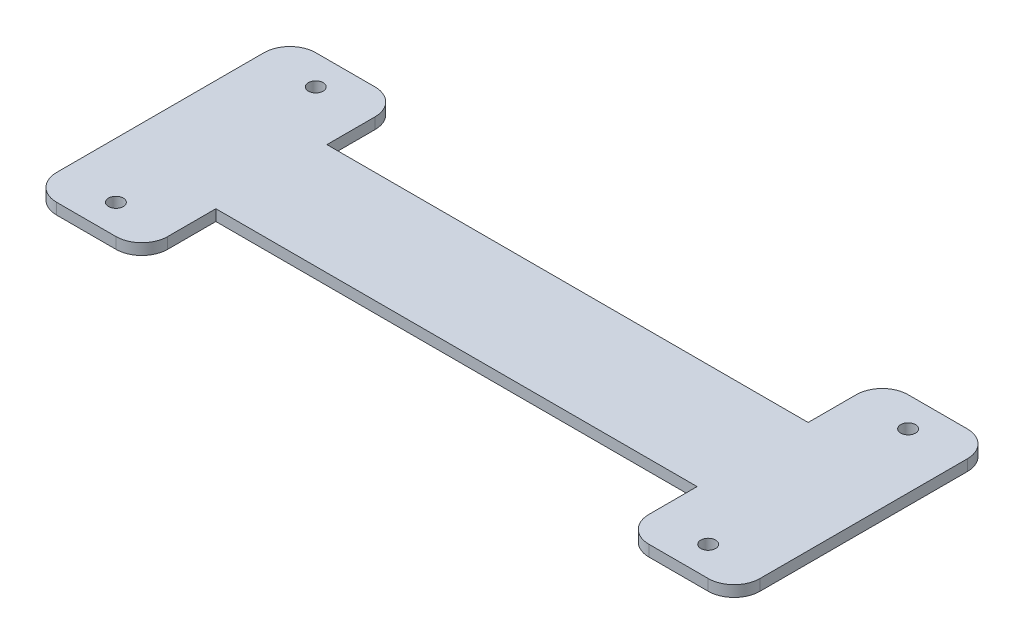
ISO-10303-21;
HEADER;
FILE_DESCRIPTION(('STEP AP214'),'2;1');
FILE_NAME('part.step','',(''),(''),'','','');
FILE_SCHEMA(('AUTOMOTIVE_DESIGN { 1 0 10303 214 1 1 1 1 }'));
ENDSEC;
DATA;
#1=APPLICATION_CONTEXT('core data for automotive mechanical design processes');
#2=APPLICATION_PROTOCOL_DEFINITION('international standard','automotive_design',2000,#1);
#3=PRODUCT_CONTEXT('',#1,'mechanical');
#4=PRODUCT('Part','Part','',(#3));
#5=PRODUCT_RELATED_PRODUCT_CATEGORY('part','',(#4));
#6=PRODUCT_DEFINITION_FORMATION('','',#4);
#7=PRODUCT_DEFINITION_CONTEXT('part definition',#1,'design');
#8=PRODUCT_DEFINITION('design','',#6,#7);
#9=PRODUCT_DEFINITION_SHAPE('','',#8);
#10=(LENGTH_UNIT() NAMED_UNIT(*) SI_UNIT(.MILLI.,.METRE.));
#11=(NAMED_UNIT(*) PLANE_ANGLE_UNIT() SI_UNIT($,.RADIAN.));
#12=(NAMED_UNIT(*) SI_UNIT($,.STERADIAN.) SOLID_ANGLE_UNIT());
#13=UNCERTAINTY_MEASURE_WITH_UNIT(LENGTH_MEASURE(1.E-05),#10,'distance_accuracy_value','');
#14=(GEOMETRIC_REPRESENTATION_CONTEXT(3) GLOBAL_UNCERTAINTY_ASSIGNED_CONTEXT((#13)) GLOBAL_UNIT_ASSIGNED_CONTEXT((#10,
#11,#12)) REPRESENTATION_CONTEXT('',''));
#15=CARTESIAN_POINT('',(0.,0.,0.));
#16=DIRECTION('',(0.,0.,1.));
#17=DIRECTION('',(1.,0.,0.));
#18=AXIS2_PLACEMENT_3D('',#15,#16,#17);
#19=CARTESIAN_POINT('',(0.,3.,70.));
#20=DIRECTION('',(0.,0.,-1.));
#21=DIRECTION('',(-1.,0.,0.));
#22=AXIS2_PLACEMENT_3D('',#19,#20,#21);
#23=PLANE('',#22);
#24=DIRECTION('',(1.,0.,0.));
#25=VECTOR('',#24,1.);
#26=CARTESIAN_POINT('',(0.,0.,70.));
#27=LINE('',#26,#25);
#28=CARTESIAN_POINT('',(7.00000000000001,0.,70.));
#29=VERTEX_POINT('',#28);
#30=CARTESIAN_POINT('',(23.,0.,70.));
#31=VERTEX_POINT('',#30);
#32=EDGE_CURVE('E274',#29,#31,#27,.T.);
#33=ORIENTED_EDGE('',*,*,#32,.T.);
#34=DIRECTION('',(0.,1.,0.));
#35=VECTOR('',#34,1.);
#36=CARTESIAN_POINT('',(23.,3.,70.));
#37=LINE('',#36,#35);
#38=CARTESIAN_POINT('',(23.,3.,70.));
#39=VERTEX_POINT('',#38);
#40=EDGE_CURVE('E333',#31,#39,#37,.T.);
#41=ORIENTED_EDGE('',*,*,#40,.T.);
#42=DIRECTION('',(1.,0.,0.));
#43=VECTOR('',#42,1.);
#44=CARTESIAN_POINT('',(0.,3.,70.));
#45=LINE('',#44,#43);
#46=CARTESIAN_POINT('',(7.00000000000001,3.,70.));
#47=VERTEX_POINT('',#46);
#48=EDGE_CURVE('E260',#47,#39,#45,.T.);
#49=ORIENTED_EDGE('',*,*,#48,.F.);
#50=DIRECTION('',(0.,-1.,0.));
#51=VECTOR('',#50,1.);
#52=CARTESIAN_POINT('',(7.00000000000001,3.,70.));
#53=LINE('',#52,#51);
#54=EDGE_CURVE('E330',#47,#29,#53,.T.);
#55=ORIENTED_EDGE('',*,*,#54,.T.);
#56=EDGE_LOOP('',(#33,#41,#49,#55));
#57=FACE_BOUND('',#56,.T.);
#58=ADVANCED_FACE('F33',(#57),#23,.F.);
#59=CARTESIAN_POINT('',(0.,3.,0.));
#60=DIRECTION('',(0.,0.,1.));
#61=DIRECTION('',(1.,0.,0.));
#62=AXIS2_PLACEMENT_3D('',#59,#60,#61);
#63=PLANE('',#62);
#64=DIRECTION('',(-1.,0.,0.));
#65=VECTOR('',#64,1.);
#66=CARTESIAN_POINT('',(0.,0.,0.));
#67=LINE('',#66,#65);
#68=CARTESIAN_POINT('',(23.,0.,0.));
#69=VERTEX_POINT('',#68);
#70=CARTESIAN_POINT('',(7.,0.,0.));
#71=VERTEX_POINT('',#70);
#72=EDGE_CURVE('E278',#69,#71,#67,.T.);
#73=ORIENTED_EDGE('',*,*,#72,.T.);
#74=DIRECTION('',(0.,-1.,0.));
#75=VECTOR('',#74,1.);
#76=CARTESIAN_POINT('',(7.,3.,0.));
#77=LINE('',#76,#75);
#78=CARTESIAN_POINT('',(7.,3.,0.));
#79=VERTEX_POINT('',#78);
#80=EDGE_CURVE('E41',#71,#79,#77,.F.);
#81=ORIENTED_EDGE('',*,*,#80,.T.);
#82=DIRECTION('',(-1.,0.,0.));
#83=VECTOR('',#82,1.);
#84=CARTESIAN_POINT('',(0.,3.,0.));
#85=LINE('',#84,#83);
#86=CARTESIAN_POINT('',(23.,3.,0.));
#87=VERTEX_POINT('',#86);
#88=EDGE_CURVE('E265',#87,#79,#85,.T.);
#89=ORIENTED_EDGE('',*,*,#88,.F.);
#90=DIRECTION('',(0.,1.,0.));
#91=VECTOR('',#90,1.);
#92=CARTESIAN_POINT('',(23.,3.,0.));
#93=LINE('',#92,#91);
#94=EDGE_CURVE('E342',#87,#69,#93,.F.);
#95=ORIENTED_EDGE('',*,*,#94,.T.);
#96=EDGE_LOOP('',(#73,#81,#89,#95));
#97=FACE_BOUND('',#96,.T.);
#98=ADVANCED_FACE('F346',(#97),#63,.F.);
#99=CARTESIAN_POINT('',(0.,3.,0.));
#100=DIRECTION('',(1.,0.,0.));
#101=DIRECTION('',(0.,0.,-1.));
#102=AXIS2_PLACEMENT_3D('',#99,#100,#101);
#103=PLANE('',#102);
#104=DIRECTION('',(0.,0.,1.));
#105=VECTOR('',#104,1.);
#106=CARTESIAN_POINT('',(0.,0.,0.));
#107=LINE('',#106,#105);
#108=CARTESIAN_POINT('',(0.,0.,7.));
#109=VERTEX_POINT('',#108);
#110=CARTESIAN_POINT('',(0.,0.,63.));
#111=VERTEX_POINT('',#110);
#112=EDGE_CURVE('E253',#109,#111,#107,.T.);
#113=ORIENTED_EDGE('',*,*,#112,.T.);
#114=DIRECTION('',(0.,-1.,0.));
#115=VECTOR('',#114,1.);
#116=CARTESIAN_POINT('',(0.,3.,63.));
#117=LINE('',#116,#115);
#118=CARTESIAN_POINT('',(0.,3.,63.));
#119=VERTEX_POINT('',#118);
#120=EDGE_CURVE('E340',#111,#119,#117,.F.);
#121=ORIENTED_EDGE('',*,*,#120,.T.);
#122=DIRECTION('',(0.,0.,1.));
#123=VECTOR('',#122,1.);
#124=CARTESIAN_POINT('',(0.,3.,0.));
#125=LINE('',#124,#123);
#126=CARTESIAN_POINT('',(0.,3.,7.));
#127=VERTEX_POINT('',#126);
#128=EDGE_CURVE('E256',#127,#119,#125,.T.);
#129=ORIENTED_EDGE('',*,*,#128,.F.);
#130=DIRECTION('',(0.,-1.,0.));
#131=VECTOR('',#130,1.);
#132=CARTESIAN_POINT('',(0.,3.,7.));
#133=LINE('',#132,#131);
#134=EDGE_CURVE('E337',#127,#109,#133,.T.);
#135=ORIENTED_EDGE('',*,*,#134,.T.);
#136=EDGE_LOOP('',(#113,#121,#129,#135));
#137=FACE_BOUND('',#136,.T.);
#138=ADVANCED_FACE('F357',(#137),#103,.F.);
#139=CARTESIAN_POINT('',(167.,3.,70.));
#140=VERTEX_POINT('',#139);
#141=CARTESIAN_POINT('',(183.,3.,70.));
#142=VERTEX_POINT('',#141);
#143=EDGE_CURVE('E258',#140,#142,#45,.T.);
#144=ORIENTED_EDGE('',*,*,#143,.F.);
#145=DIRECTION('',(0.,1.,0.));
#146=VECTOR('',#145,1.);
#147=CARTESIAN_POINT('',(167.,3.,70.));
#148=LINE('',#147,#146);
#149=CARTESIAN_POINT('',(167.,0.,70.));
#150=VERTEX_POINT('',#149);
#151=EDGE_CURVE('E328',#140,#150,#148,.F.);
#152=ORIENTED_EDGE('',*,*,#151,.T.);
#153=CARTESIAN_POINT('',(183.,0.,70.));
#154=VERTEX_POINT('',#153);
#155=EDGE_CURVE('E271',#150,#154,#27,.T.);
#156=ORIENTED_EDGE('',*,*,#155,.T.);
#157=DIRECTION('',(0.,-1.,0.));
#158=VECTOR('',#157,1.);
#159=CARTESIAN_POINT('',(183.,3.,70.));
#160=LINE('',#159,#158);
#161=EDGE_CURVE('E326',#154,#142,#160,.F.);
#162=ORIENTED_EDGE('',*,*,#161,.T.);
#163=EDGE_LOOP('',(#144,#152,#156,#162));
#164=FACE_BOUND('',#163,.T.);
#165=ADVANCED_FACE('F387',(#164),#23,.F.);
#166=CARTESIAN_POINT('',(190.,3.,0.));
#167=DIRECTION('',(-1.,0.,0.));
#168=DIRECTION('',(0.,0.,1.));
#169=AXIS2_PLACEMENT_3D('',#166,#167,#168);
#170=PLANE('',#169);
#171=DIRECTION('',(0.,0.,-1.));
#172=VECTOR('',#171,1.);
#173=CARTESIAN_POINT('',(190.,0.,0.));
#174=LINE('',#173,#172);
#175=CARTESIAN_POINT('',(190.,0.,63.));
#176=VERTEX_POINT('',#175);
#177=CARTESIAN_POINT('',(190.,0.,7.));
#178=VERTEX_POINT('',#177);
#179=EDGE_CURVE('E275',#176,#178,#174,.T.);
#180=ORIENTED_EDGE('',*,*,#179,.T.);
#181=DIRECTION('',(0.,-1.,0.));
#182=VECTOR('',#181,1.);
#183=CARTESIAN_POINT('',(190.,3.,7.));
#184=LINE('',#183,#182);
#185=CARTESIAN_POINT('',(190.,3.,7.));
#186=VERTEX_POINT('',#185);
#187=EDGE_CURVE('E305',#178,#186,#184,.F.);
#188=ORIENTED_EDGE('',*,*,#187,.T.);
#189=DIRECTION('',(0.,0.,-1.));
#190=VECTOR('',#189,1.);
#191=CARTESIAN_POINT('',(190.,3.,0.));
#192=LINE('',#191,#190);
#193=CARTESIAN_POINT('',(190.,3.,63.));
#194=VERTEX_POINT('',#193);
#195=EDGE_CURVE('E262',#194,#186,#192,.T.);
#196=ORIENTED_EDGE('',*,*,#195,.F.);
#197=DIRECTION('',(0.,-1.,0.));
#198=VECTOR('',#197,1.);
#199=CARTESIAN_POINT('',(190.,3.,63.));
#200=LINE('',#199,#198);
#201=EDGE_CURVE('E302',#194,#176,#200,.T.);
#202=ORIENTED_EDGE('',*,*,#201,.T.);
#203=EDGE_LOOP('',(#180,#188,#196,#202));
#204=FACE_BOUND('',#203,.T.);
#205=ADVANCED_FACE('F399',(#204),#170,.F.);
#206=CARTESIAN_POINT('',(183.,3.,0.));
#207=VERTEX_POINT('',#206);
#208=CARTESIAN_POINT('',(167.,3.,0.));
#209=VERTEX_POINT('',#208);
#210=EDGE_CURVE('E268',#207,#209,#85,.T.);
#211=ORIENTED_EDGE('',*,*,#210,.F.);
#212=DIRECTION('',(0.,-1.,0.));
#213=VECTOR('',#212,1.);
#214=CARTESIAN_POINT('',(183.,3.,0.));
#215=LINE('',#214,#213);
#216=CARTESIAN_POINT('',(183.,0.,0.));
#217=VERTEX_POINT('',#216);
#218=EDGE_CURVE('E284',#207,#217,#215,.T.);
#219=ORIENTED_EDGE('',*,*,#218,.T.);
#220=CARTESIAN_POINT('',(167.,0.,0.));
#221=VERTEX_POINT('',#220);
#222=EDGE_CURVE('E259',#217,#221,#67,.T.);
#223=ORIENTED_EDGE('',*,*,#222,.T.);
#224=DIRECTION('',(0.,1.,0.));
#225=VECTOR('',#224,1.);
#226=CARTESIAN_POINT('',(167.,3.,0.));
#227=LINE('',#226,#225);
#228=EDGE_CURVE('E281',#221,#209,#227,.T.);
#229=ORIENTED_EDGE('',*,*,#228,.T.);
#230=EDGE_LOOP('',(#211,#219,#223,#229));
#231=FACE_BOUND('',#230,.T.);
#232=ADVANCED_FACE('F407',(#231),#63,.F.);
#233=CARTESIAN_POINT('',(0.,3.,0.));
#234=DIRECTION('',(0.,1.,0.));
#235=DIRECTION('',(0.,0.,1.));
#236=AXIS2_PLACEMENT_3D('',#233,#234,#235);
#237=PLANE('',#236);
#238=CARTESIAN_POINT('',(175.,3.,8.00000000000001));
#239=DIRECTION('',(0.,1.,0.));
#240=DIRECTION('',(0.,0.,1.));
#241=AXIS2_PLACEMENT_3D('',#238,#239,#240);
#242=CIRCLE('',#241,2.);
#243=CARTESIAN_POINT('',(175.,3.,10.));
#244=VERTEX_POINT('',#243);
#245=EDGE_CURVE('E215',#244,#244,#242,.T.);
#246=ORIENTED_EDGE('',*,*,#245,.F.);
#247=EDGE_LOOP('',(#246));
#248=FACE_BOUND('',#247,.T.);
#249=CARTESIAN_POINT('',(175.,3.,62.));
#250=DIRECTION('',(0.,1.,0.));
#251=DIRECTION('',(0.,0.,1.));
#252=AXIS2_PLACEMENT_3D('',#249,#250,#251);
#253=CIRCLE('',#252,2.);
#254=CARTESIAN_POINT('',(175.,3.,64.));
#255=VERTEX_POINT('',#254);
#256=EDGE_CURVE('E221',#255,#255,#253,.T.);
#257=ORIENTED_EDGE('',*,*,#256,.F.);
#258=EDGE_LOOP('',(#257));
#259=FACE_BOUND('',#258,.T.);
#260=CARTESIAN_POINT('',(15.,3.,62.));
#261=DIRECTION('',(0.,1.,0.));
#262=DIRECTION('',(0.,0.,1.));
#263=AXIS2_PLACEMENT_3D('',#260,#261,#262);
#264=CIRCLE('',#263,2.00000000000001);
#265=CARTESIAN_POINT('',(15.,3.,64.));
#266=VERTEX_POINT('',#265);
#267=EDGE_CURVE('E227',#266,#266,#264,.T.);
#268=ORIENTED_EDGE('',*,*,#267,.F.);
#269=EDGE_LOOP('',(#268));
#270=FACE_BOUND('',#269,.T.);
#271=ORIENTED_EDGE('',*,*,#195,.T.);
#272=CARTESIAN_POINT('',(183.,3.,7.));
#273=DIRECTION('',(0.,1.,0.));
#274=DIRECTION('',(0.,0.,1.));
#275=AXIS2_PLACEMENT_3D('',#272,#273,#274);
#276=CIRCLE('',#275,7.);
#277=EDGE_CURVE('E319',#186,#207,#276,.T.);
#278=ORIENTED_EDGE('',*,*,#277,.T.);
#279=ORIENTED_EDGE('',*,*,#210,.T.);
#280=CARTESIAN_POINT('',(167.,3.,7.));
#281=DIRECTION('',(0.,1.,0.));
#282=DIRECTION('',(0.,0.,1.));
#283=AXIS2_PLACEMENT_3D('',#280,#281,#282);
#284=CIRCLE('',#283,7.);
#285=CARTESIAN_POINT('',(160.,3.,7.));
#286=VERTEX_POINT('',#285);
#287=EDGE_CURVE('E317',#209,#286,#284,.T.);
#288=ORIENTED_EDGE('',*,*,#287,.T.);
#289=DIRECTION('',(0.,0.,-1.));
#290=VECTOR('',#289,1.);
#291=CARTESIAN_POINT('',(160.,3.,20.));
#292=LINE('',#291,#290);
#293=CARTESIAN_POINT('',(160.,3.,20.));
#294=VERTEX_POINT('',#293);
#295=EDGE_CURVE('E186',#294,#286,#292,.T.);
#296=ORIENTED_EDGE('',*,*,#295,.F.);
#297=DIRECTION('',(1.,0.,0.));
#298=VECTOR('',#297,1.);
#299=CARTESIAN_POINT('',(30.,3.,20.));
#300=LINE('',#299,#298);
#301=CARTESIAN_POINT('',(30.,3.,20.));
#302=VERTEX_POINT('',#301);
#303=EDGE_CURVE('E205',#302,#294,#300,.T.);
#304=ORIENTED_EDGE('',*,*,#303,.F.);
#305=DIRECTION('',(0.,0.,1.));
#306=VECTOR('',#305,1.);
#307=CARTESIAN_POINT('',(30.,3.,20.));
#308=LINE('',#307,#306);
#309=CARTESIAN_POINT('',(30.,3.,7.));
#310=VERTEX_POINT('',#309);
#311=EDGE_CURVE('E192',#310,#302,#308,.T.);
#312=ORIENTED_EDGE('',*,*,#311,.F.);
#313=CARTESIAN_POINT('',(23.,3.,7.));
#314=DIRECTION('',(0.,1.,0.));
#315=DIRECTION('',(0.,0.,1.));
#316=AXIS2_PLACEMENT_3D('',#313,#314,#315);
#317=CIRCLE('',#316,7.);
#318=EDGE_CURVE('E307',#310,#87,#317,.T.);
#319=ORIENTED_EDGE('',*,*,#318,.T.);
#320=ORIENTED_EDGE('',*,*,#88,.T.);
#321=CARTESIAN_POINT('',(7.,3.,7.));
#322=DIRECTION('',(0.,1.,0.));
#323=DIRECTION('',(0.,0.,1.));
#324=AXIS2_PLACEMENT_3D('',#321,#322,#323);
#325=CIRCLE('',#324,7.);
#326=EDGE_CURVE('E309',#79,#127,#325,.T.);
#327=ORIENTED_EDGE('',*,*,#326,.T.);
#328=ORIENTED_EDGE('',*,*,#128,.T.);
#329=CARTESIAN_POINT('',(7.00000000000001,3.,63.));
#330=DIRECTION('',(0.,1.,0.));
#331=DIRECTION('',(0.,0.,1.));
#332=AXIS2_PLACEMENT_3D('',#329,#330,#331);
#333=CIRCLE('',#332,7.);
#334=EDGE_CURVE('E56',#119,#47,#333,.T.);
#335=ORIENTED_EDGE('',*,*,#334,.T.);
#336=ORIENTED_EDGE('',*,*,#48,.T.);
#337=CARTESIAN_POINT('',(23.,3.,63.));
#338=DIRECTION('',(0.,1.,0.));
#339=DIRECTION('',(0.,0.,1.));
#340=AXIS2_PLACEMENT_3D('',#337,#338,#339);
#341=CIRCLE('',#340,7.);
#342=CARTESIAN_POINT('',(30.,3.,63.));
#343=VERTEX_POINT('',#342);
#344=EDGE_CURVE('E48',#39,#343,#341,.T.);
#345=ORIENTED_EDGE('',*,*,#344,.T.);
#346=DIRECTION('',(0.,0.,1.));
#347=VECTOR('',#346,1.);
#348=CARTESIAN_POINT('',(30.,3.,50.));
#349=LINE('',#348,#347);
#350=CARTESIAN_POINT('',(30.,3.,50.));
#351=VERTEX_POINT('',#350);
#352=EDGE_CURVE('E209',#351,#343,#349,.T.);
#353=ORIENTED_EDGE('',*,*,#352,.F.);
#354=DIRECTION('',(-1.,0.,0.));
#355=VECTOR('',#354,1.);
#356=CARTESIAN_POINT('',(30.,3.,50.));
#357=LINE('',#356,#355);
#358=CARTESIAN_POINT('',(160.,3.,50.));
#359=VERTEX_POINT('',#358);
#360=EDGE_CURVE('E235',#359,#351,#357,.T.);
#361=ORIENTED_EDGE('',*,*,#360,.F.);
#362=DIRECTION('',(0.,0.,-1.));
#363=VECTOR('',#362,1.);
#364=CARTESIAN_POINT('',(160.,3.,50.));
#365=LINE('',#364,#363);
#366=CARTESIAN_POINT('',(160.,3.,63.));
#367=VERTEX_POINT('',#366);
#368=EDGE_CURVE('E243',#367,#359,#365,.T.);
#369=ORIENTED_EDGE('',*,*,#368,.F.);
#370=CARTESIAN_POINT('',(167.,3.,63.));
#371=DIRECTION('',(0.,1.,0.));
#372=DIRECTION('',(0.,0.,1.));
#373=AXIS2_PLACEMENT_3D('',#370,#371,#372);
#374=CIRCLE('',#373,7.);
#375=EDGE_CURVE('E315',#367,#140,#374,.T.);
#376=ORIENTED_EDGE('',*,*,#375,.T.);
#377=ORIENTED_EDGE('',*,*,#143,.T.);
#378=CARTESIAN_POINT('',(183.,3.,63.));
#379=DIRECTION('',(0.,1.,0.));
#380=DIRECTION('',(0.,0.,1.));
#381=AXIS2_PLACEMENT_3D('',#378,#379,#380);
#382=CIRCLE('',#381,7.);
#383=EDGE_CURVE('E313',#142,#194,#382,.T.);
#384=ORIENTED_EDGE('',*,*,#383,.T.);
#385=EDGE_LOOP('',(#271,#278,#279,#288,#296,#304,#312,#319,#320,#327,#328,#335,#336,#345,#353,
#361,#369,#376,#377,#384));
#386=FACE_BOUND('',#385,.T.);
#387=CARTESIAN_POINT('',(15.,3.,8.));
#388=DIRECTION('',(0.,1.,0.));
#389=DIRECTION('',(0.,0.,1.));
#390=AXIS2_PLACEMENT_3D('',#387,#388,#389);
#391=CIRCLE('',#390,2.);
#392=CARTESIAN_POINT('',(15.,3.,10.));
#393=VERTEX_POINT('',#392);
#394=EDGE_CURVE('E214',#393,#393,#391,.T.);
#395=ORIENTED_EDGE('',*,*,#394,.F.);
#396=EDGE_LOOP('',(#395));
#397=FACE_BOUND('',#396,.T.);
#398=ADVANCED_FACE('F350',(#248,#259,#270,#386,#397),#237,.T.);
#399=CARTESIAN_POINT('',(0.,0.,0.));
#400=DIRECTION('',(0.,1.,0.));
#401=DIRECTION('',(0.,0.,1.));
#402=AXIS2_PLACEMENT_3D('',#399,#400,#401);
#403=PLANE('',#402);
#404=CARTESIAN_POINT('',(175.,0.,8.00000000000001));
#405=DIRECTION('',(0.,1.,0.));
#406=DIRECTION('',(0.,0.,1.));
#407=AXIS2_PLACEMENT_3D('',#404,#405,#406);
#408=CIRCLE('',#407,2.);
#409=CARTESIAN_POINT('',(175.,0.,10.));
#410=VERTEX_POINT('',#409);
#411=EDGE_CURVE('E211',#410,#410,#408,.T.);
#412=ORIENTED_EDGE('',*,*,#411,.T.);
#413=EDGE_LOOP('',(#412));
#414=FACE_BOUND('',#413,.T.);
#415=CARTESIAN_POINT('',(175.,0.,62.));
#416=DIRECTION('',(0.,1.,0.));
#417=DIRECTION('',(0.,0.,1.));
#418=AXIS2_PLACEMENT_3D('',#415,#416,#417);
#419=CIRCLE('',#418,2.);
#420=CARTESIAN_POINT('',(175.,0.,64.));
#421=VERTEX_POINT('',#420);
#422=EDGE_CURVE('E218',#421,#421,#419,.T.);
#423=ORIENTED_EDGE('',*,*,#422,.T.);
#424=EDGE_LOOP('',(#423));
#425=FACE_BOUND('',#424,.T.);
#426=CARTESIAN_POINT('',(15.,0.,62.));
#427=DIRECTION('',(0.,1.,0.));
#428=DIRECTION('',(0.,0.,1.));
#429=AXIS2_PLACEMENT_3D('',#426,#427,#428);
#430=CIRCLE('',#429,2.00000000000001);
#431=CARTESIAN_POINT('',(15.,0.,64.));
#432=VERTEX_POINT('',#431);
#433=EDGE_CURVE('E224',#432,#432,#430,.T.);
#434=ORIENTED_EDGE('',*,*,#433,.T.);
#435=EDGE_LOOP('',(#434));
#436=FACE_BOUND('',#435,.T.);
#437=ORIENTED_EDGE('',*,*,#222,.F.);
#438=CARTESIAN_POINT('',(183.,0.,7.));
#439=DIRECTION('',(0.,1.,0.));
#440=DIRECTION('',(0.,0.,1.));
#441=AXIS2_PLACEMENT_3D('',#438,#439,#440);
#442=CIRCLE('',#441,7.);
#443=EDGE_CURVE('E300',#217,#178,#442,.F.);
#444=ORIENTED_EDGE('',*,*,#443,.T.);
#445=ORIENTED_EDGE('',*,*,#179,.F.);
#446=CARTESIAN_POINT('',(183.,0.,63.));
#447=DIRECTION('',(0.,1.,0.));
#448=DIRECTION('',(0.,0.,1.));
#449=AXIS2_PLACEMENT_3D('',#446,#447,#448);
#450=CIRCLE('',#449,7.);
#451=EDGE_CURVE('E294',#176,#154,#450,.F.);
#452=ORIENTED_EDGE('',*,*,#451,.T.);
#453=ORIENTED_EDGE('',*,*,#155,.F.);
#454=CARTESIAN_POINT('',(167.,0.,63.));
#455=DIRECTION('',(0.,1.,0.));
#456=DIRECTION('',(0.,0.,1.));
#457=AXIS2_PLACEMENT_3D('',#454,#455,#456);
#458=CIRCLE('',#457,7.);
#459=CARTESIAN_POINT('',(160.,0.,63.));
#460=VERTEX_POINT('',#459);
#461=EDGE_CURVE('E296',#150,#460,#458,.F.);
#462=ORIENTED_EDGE('',*,*,#461,.T.);
#463=DIRECTION('',(0.,0.,-1.));
#464=VECTOR('',#463,1.);
#465=CARTESIAN_POINT('',(160.,0.,50.));
#466=LINE('',#465,#464);
#467=CARTESIAN_POINT('',(160.,0.,50.));
#468=VERTEX_POINT('',#467);
#469=EDGE_CURVE('E234',#460,#468,#466,.T.);
#470=ORIENTED_EDGE('',*,*,#469,.T.);
#471=DIRECTION('',(-1.,0.,0.));
#472=VECTOR('',#471,1.);
#473=CARTESIAN_POINT('',(30.,0.,50.));
#474=LINE('',#473,#472);
#475=CARTESIAN_POINT('',(30.,0.,50.));
#476=VERTEX_POINT('',#475);
#477=EDGE_CURVE('E237',#468,#476,#474,.T.);
#478=ORIENTED_EDGE('',*,*,#477,.T.);
#479=DIRECTION('',(0.,0.,1.));
#480=VECTOR('',#479,1.);
#481=CARTESIAN_POINT('',(30.,0.,50.));
#482=LINE('',#481,#480);
#483=CARTESIAN_POINT('',(30.,0.,63.));
#484=VERTEX_POINT('',#483);
#485=EDGE_CURVE('E231',#476,#484,#482,.T.);
#486=ORIENTED_EDGE('',*,*,#485,.T.);
#487=CARTESIAN_POINT('',(23.,0.,63.));
#488=DIRECTION('',(0.,1.,0.));
#489=DIRECTION('',(0.,0.,1.));
#490=AXIS2_PLACEMENT_3D('',#487,#488,#489);
#491=CIRCLE('',#490,7.);
#492=EDGE_CURVE('E292',#484,#31,#491,.F.);
#493=ORIENTED_EDGE('',*,*,#492,.T.);
#494=ORIENTED_EDGE('',*,*,#32,.F.);
#495=CARTESIAN_POINT('',(7.00000000000001,0.,63.));
#496=DIRECTION('',(0.,1.,0.));
#497=DIRECTION('',(0.,0.,1.));
#498=AXIS2_PLACEMENT_3D('',#495,#496,#497);
#499=CIRCLE('',#498,7.);
#500=EDGE_CURVE('E290',#29,#111,#499,.F.);
#501=ORIENTED_EDGE('',*,*,#500,.T.);
#502=ORIENTED_EDGE('',*,*,#112,.F.);
#503=CARTESIAN_POINT('',(7.,0.,7.));
#504=DIRECTION('',(0.,1.,0.));
#505=DIRECTION('',(0.,0.,1.));
#506=AXIS2_PLACEMENT_3D('',#503,#504,#505);
#507=CIRCLE('',#506,7.);
#508=EDGE_CURVE('E288',#109,#71,#507,.F.);
#509=ORIENTED_EDGE('',*,*,#508,.T.);
#510=ORIENTED_EDGE('',*,*,#72,.F.);
#511=CARTESIAN_POINT('',(23.,0.,7.));
#512=DIRECTION('',(0.,1.,0.));
#513=DIRECTION('',(0.,0.,1.));
#514=AXIS2_PLACEMENT_3D('',#511,#512,#513);
#515=CIRCLE('',#514,7.);
#516=CARTESIAN_POINT('',(30.,0.,7.));
#517=VERTEX_POINT('',#516);
#518=EDGE_CURVE('E183',#69,#517,#515,.F.);
#519=ORIENTED_EDGE('',*,*,#518,.T.);
#520=DIRECTION('',(0.,0.,1.));
#521=VECTOR('',#520,1.);
#522=CARTESIAN_POINT('',(30.,0.,20.));
#523=LINE('',#522,#521);
#524=CARTESIAN_POINT('',(30.,0.,20.));
#525=VERTEX_POINT('',#524);
#526=EDGE_CURVE('E173',#517,#525,#523,.T.);
#527=ORIENTED_EDGE('',*,*,#526,.T.);
#528=DIRECTION('',(1.,0.,0.));
#529=VECTOR('',#528,1.);
#530=CARTESIAN_POINT('',(30.,0.,20.));
#531=LINE('',#530,#529);
#532=CARTESIAN_POINT('',(160.,0.,20.));
#533=VERTEX_POINT('',#532);
#534=EDGE_CURVE('E180',#525,#533,#531,.T.);
#535=ORIENTED_EDGE('',*,*,#534,.T.);
#536=DIRECTION('',(0.,0.,-1.));
#537=VECTOR('',#536,1.);
#538=CARTESIAN_POINT('',(160.,0.,20.));
#539=LINE('',#538,#537);
#540=CARTESIAN_POINT('',(160.,0.,7.));
#541=VERTEX_POINT('',#540);
#542=EDGE_CURVE('E197',#533,#541,#539,.T.);
#543=ORIENTED_EDGE('',*,*,#542,.T.);
#544=CARTESIAN_POINT('',(167.,0.,7.));
#545=DIRECTION('',(0.,1.,0.));
#546=DIRECTION('',(0.,0.,1.));
#547=AXIS2_PLACEMENT_3D('',#544,#545,#546);
#548=CIRCLE('',#547,7.);
#549=EDGE_CURVE('E298',#541,#221,#548,.F.);
#550=ORIENTED_EDGE('',*,*,#549,.T.);
#551=EDGE_LOOP('',(#437,#444,#445,#452,#453,#462,#470,#478,#486,#493,#494,#501,#502,#509,#510,
#519,#527,#535,#543,#550));
#552=FACE_BOUND('',#551,.T.);
#553=CARTESIAN_POINT('',(15.,0.,8.));
#554=DIRECTION('',(0.,1.,0.));
#555=DIRECTION('',(0.,0.,1.));
#556=AXIS2_PLACEMENT_3D('',#553,#554,#555);
#557=CIRCLE('',#556,2.);
#558=CARTESIAN_POINT('',(15.,0.,10.));
#559=VERTEX_POINT('',#558);
#560=EDGE_CURVE('E250',#559,#559,#557,.T.);
#561=ORIENTED_EDGE('',*,*,#560,.T.);
#562=EDGE_LOOP('',(#561));
#563=FACE_BOUND('',#562,.T.);
#564=ADVANCED_FACE('F176',(#414,#425,#436,#552,#563),#403,.F.);
#565=CARTESIAN_POINT('',(15.,0.,8.));
#566=DIRECTION('',(0.,1.,0.));
#567=DIRECTION('',(0.,0.,1.));
#568=AXIS2_PLACEMENT_3D('',#565,#566,#567);
#569=CYLINDRICAL_SURFACE('',#568,2.);
#570=ORIENTED_EDGE('',*,*,#560,.F.);
#571=EDGE_LOOP('',(#570));
#572=FACE_BOUND('',#571,.T.);
#573=ORIENTED_EDGE('',*,*,#394,.T.);
#574=EDGE_LOOP('',(#573));
#575=FACE_BOUND('',#574,.T.);
#576=ADVANCED_FACE('F425',(#572,#575),#569,.F.);
#577=CARTESIAN_POINT('',(30.,0.,20.));
#578=DIRECTION('',(-1.,0.,0.));
#579=DIRECTION('',(0.,0.,1.));
#580=AXIS2_PLACEMENT_3D('',#577,#578,#579);
#581=PLANE('',#580);
#582=ORIENTED_EDGE('',*,*,#526,.F.);
#583=DIRECTION('',(0.,1.,0.));
#584=VECTOR('',#583,1.);
#585=CARTESIAN_POINT('',(30.,0.,7.));
#586=LINE('',#585,#584);
#587=EDGE_CURVE('E11',#517,#310,#586,.T.);
#588=ORIENTED_EDGE('',*,*,#587,.T.);
#589=ORIENTED_EDGE('',*,*,#311,.T.);
#590=DIRECTION('',(0.,1.,0.));
#591=VECTOR('',#590,1.);
#592=CARTESIAN_POINT('',(30.,0.,20.));
#593=LINE('',#592,#591);
#594=EDGE_CURVE('E189',#525,#302,#593,.T.);
#595=ORIENTED_EDGE('',*,*,#594,.F.);
#596=EDGE_LOOP('',(#582,#588,#589,#595));
#597=FACE_BOUND('',#596,.T.);
#598=ADVANCED_FACE('F190',(#597),#581,.F.);
#599=CARTESIAN_POINT('',(160.,0.,20.));
#600=DIRECTION('',(1.,0.,0.));
#601=DIRECTION('',(0.,0.,-1.));
#602=AXIS2_PLACEMENT_3D('',#599,#600,#601);
#603=PLANE('',#602);
#604=ORIENTED_EDGE('',*,*,#295,.T.);
#605=DIRECTION('',(0.,1.,0.));
#606=VECTOR('',#605,1.);
#607=CARTESIAN_POINT('',(160.,0.,7.));
#608=LINE('',#607,#606);
#609=EDGE_CURVE('E321',#286,#541,#608,.F.);
#610=ORIENTED_EDGE('',*,*,#609,.T.);
#611=ORIENTED_EDGE('',*,*,#542,.F.);
#612=DIRECTION('',(0.,1.,0.));
#613=VECTOR('',#612,1.);
#614=CARTESIAN_POINT('',(160.,0.,20.));
#615=LINE('',#614,#613);
#616=EDGE_CURVE('E196',#533,#294,#615,.T.);
#617=ORIENTED_EDGE('',*,*,#616,.T.);
#618=EDGE_LOOP('',(#604,#610,#611,#617));
#619=FACE_BOUND('',#618,.T.);
#620=ADVANCED_FACE('F416',(#619),#603,.F.);
#621=CARTESIAN_POINT('',(30.,0.,20.));
#622=DIRECTION('',(0.,0.,1.));
#623=DIRECTION('',(1.,0.,0.));
#624=AXIS2_PLACEMENT_3D('',#621,#622,#623);
#625=PLANE('',#624);
#626=ORIENTED_EDGE('',*,*,#303,.T.);
#627=ORIENTED_EDGE('',*,*,#616,.F.);
#628=ORIENTED_EDGE('',*,*,#534,.F.);
#629=ORIENTED_EDGE('',*,*,#594,.T.);
#630=EDGE_LOOP('',(#626,#627,#628,#629));
#631=FACE_BOUND('',#630,.T.);
#632=ADVANCED_FACE('F200',(#631),#625,.F.);
#633=CARTESIAN_POINT('',(30.,0.,50.));
#634=DIRECTION('',(-1.,0.,0.));
#635=DIRECTION('',(0.,0.,1.));
#636=AXIS2_PLACEMENT_3D('',#633,#634,#635);
#637=PLANE('',#636);
#638=ORIENTED_EDGE('',*,*,#352,.T.);
#639=DIRECTION('',(0.,1.,0.));
#640=VECTOR('',#639,1.);
#641=CARTESIAN_POINT('',(30.,0.,63.));
#642=LINE('',#641,#640);
#643=EDGE_CURVE('E335',#343,#484,#642,.F.);
#644=ORIENTED_EDGE('',*,*,#643,.T.);
#645=ORIENTED_EDGE('',*,*,#485,.F.);
#646=DIRECTION('',(0.,1.,0.));
#647=VECTOR('',#646,1.);
#648=CARTESIAN_POINT('',(30.,0.,50.));
#649=LINE('',#648,#647);
#650=EDGE_CURVE('E230',#476,#351,#649,.T.);
#651=ORIENTED_EDGE('',*,*,#650,.T.);
#652=EDGE_LOOP('',(#638,#644,#645,#651));
#653=FACE_BOUND('',#652,.T.);
#654=ADVANCED_FACE('F368',(#653),#637,.F.);
#655=CARTESIAN_POINT('',(30.,0.,50.));
#656=DIRECTION('',(0.,0.,-1.));
#657=DIRECTION('',(-1.,0.,0.));
#658=AXIS2_PLACEMENT_3D('',#655,#656,#657);
#659=PLANE('',#658);
#660=ORIENTED_EDGE('',*,*,#360,.T.);
#661=ORIENTED_EDGE('',*,*,#650,.F.);
#662=ORIENTED_EDGE('',*,*,#477,.F.);
#663=DIRECTION('',(0.,1.,0.));
#664=VECTOR('',#663,1.);
#665=CARTESIAN_POINT('',(160.,0.,50.));
#666=LINE('',#665,#664);
#667=EDGE_CURVE('E240',#468,#359,#666,.T.);
#668=ORIENTED_EDGE('',*,*,#667,.T.);
#669=EDGE_LOOP('',(#660,#661,#662,#668));
#670=FACE_BOUND('',#669,.T.);
#671=ADVANCED_FACE('F376',(#670),#659,.F.);
#672=CARTESIAN_POINT('',(160.,0.,50.));
#673=DIRECTION('',(1.,0.,0.));
#674=DIRECTION('',(0.,0.,-1.));
#675=AXIS2_PLACEMENT_3D('',#672,#673,#674);
#676=PLANE('',#675);
#677=ORIENTED_EDGE('',*,*,#469,.F.);
#678=DIRECTION('',(0.,1.,0.));
#679=VECTOR('',#678,1.);
#680=CARTESIAN_POINT('',(160.,0.,63.));
#681=LINE('',#680,#679);
#682=EDGE_CURVE('E323',#460,#367,#681,.T.);
#683=ORIENTED_EDGE('',*,*,#682,.T.);
#684=ORIENTED_EDGE('',*,*,#368,.T.);
#685=ORIENTED_EDGE('',*,*,#667,.F.);
#686=EDGE_LOOP('',(#677,#683,#684,#685));
#687=FACE_BOUND('',#686,.T.);
#688=ADVANCED_FACE('F378',(#687),#676,.F.);
#689=CARTESIAN_POINT('',(15.,0.,62.));
#690=DIRECTION('',(0.,1.,0.));
#691=DIRECTION('',(0.,0.,1.));
#692=AXIS2_PLACEMENT_3D('',#689,#690,#691);
#693=CYLINDRICAL_SURFACE('',#692,2.00000000000001);
#694=ORIENTED_EDGE('',*,*,#433,.F.);
#695=EDGE_LOOP('',(#694));
#696=FACE_BOUND('',#695,.T.);
#697=ORIENTED_EDGE('',*,*,#267,.T.);
#698=EDGE_LOOP('',(#697));
#699=FACE_BOUND('',#698,.T.);
#700=ADVANCED_FACE('F512',(#696,#699),#693,.F.);
#701=CARTESIAN_POINT('',(175.,0.,62.));
#702=DIRECTION('',(0.,1.,0.));
#703=DIRECTION('',(0.,0.,1.));
#704=AXIS2_PLACEMENT_3D('',#701,#702,#703);
#705=CYLINDRICAL_SURFACE('',#704,2.);
#706=ORIENTED_EDGE('',*,*,#422,.F.);
#707=EDGE_LOOP('',(#706));
#708=FACE_BOUND('',#707,.T.);
#709=ORIENTED_EDGE('',*,*,#256,.T.);
#710=EDGE_LOOP('',(#709));
#711=FACE_BOUND('',#710,.T.);
#712=ADVANCED_FACE('F541',(#708,#711),#705,.F.);
#713=CARTESIAN_POINT('',(175.,0.,8.00000000000001));
#714=DIRECTION('',(0.,1.,0.));
#715=DIRECTION('',(0.,0.,1.));
#716=AXIS2_PLACEMENT_3D('',#713,#714,#715);
#717=CYLINDRICAL_SURFACE('',#716,2.);
#718=ORIENTED_EDGE('',*,*,#411,.F.);
#719=EDGE_LOOP('',(#718));
#720=FACE_BOUND('',#719,.T.);
#721=ORIENTED_EDGE('',*,*,#245,.T.);
#722=EDGE_LOOP('',(#721));
#723=FACE_BOUND('',#722,.T.);
#724=ADVANCED_FACE('F446',(#720,#723),#717,.F.);
#725=CARTESIAN_POINT('',(183.,3.,7.));
#726=DIRECTION('',(0.,-1.,0.));
#727=DIRECTION('',(0.,0.,-1.));
#728=AXIS2_PLACEMENT_3D('',#725,#726,#727);
#729=CYLINDRICAL_SURFACE('',#728,7.);
#730=ORIENTED_EDGE('',*,*,#277,.F.);
#731=ORIENTED_EDGE('',*,*,#187,.F.);
#732=ORIENTED_EDGE('',*,*,#443,.F.);
#733=ORIENTED_EDGE('',*,*,#218,.F.);
#734=EDGE_LOOP('',(#730,#731,#732,#733));
#735=FACE_BOUND('',#734,.T.);
#736=ADVANCED_FACE('F402',(#735),#729,.T.);
#737=CARTESIAN_POINT('',(167.,3.,7.));
#738=DIRECTION('',(0.,1.,0.));
#739=DIRECTION('',(0.,0.,1.));
#740=AXIS2_PLACEMENT_3D('',#737,#738,#739);
#741=CYLINDRICAL_SURFACE('',#740,7.);
#742=ORIENTED_EDGE('',*,*,#549,.F.);
#743=ORIENTED_EDGE('',*,*,#609,.F.);
#744=ORIENTED_EDGE('',*,*,#287,.F.);
#745=ORIENTED_EDGE('',*,*,#228,.F.);
#746=EDGE_LOOP('',(#742,#743,#744,#745));
#747=FACE_BOUND('',#746,.T.);
#748=ADVANCED_FACE('F412',(#747),#741,.T.);
#749=CARTESIAN_POINT('',(167.,0.,63.));
#750=DIRECTION('',(0.,1.,0.));
#751=DIRECTION('',(0.,0.,1.));
#752=AXIS2_PLACEMENT_3D('',#749,#750,#751);
#753=CYLINDRICAL_SURFACE('',#752,7.);
#754=ORIENTED_EDGE('',*,*,#461,.F.);
#755=ORIENTED_EDGE('',*,*,#151,.F.);
#756=ORIENTED_EDGE('',*,*,#375,.F.);
#757=ORIENTED_EDGE('',*,*,#682,.F.);
#758=EDGE_LOOP('',(#754,#755,#756,#757));
#759=FACE_BOUND('',#758,.T.);
#760=ADVANCED_FACE('F391',(#759),#753,.T.);
#761=CARTESIAN_POINT('',(183.,3.,63.));
#762=DIRECTION('',(0.,-1.,0.));
#763=DIRECTION('',(0.,0.,-1.));
#764=AXIS2_PLACEMENT_3D('',#761,#762,#763);
#765=CYLINDRICAL_SURFACE('',#764,7.);
#766=ORIENTED_EDGE('',*,*,#383,.F.);
#767=ORIENTED_EDGE('',*,*,#161,.F.);
#768=ORIENTED_EDGE('',*,*,#451,.F.);
#769=ORIENTED_EDGE('',*,*,#201,.F.);
#770=EDGE_LOOP('',(#766,#767,#768,#769));
#771=FACE_BOUND('',#770,.T.);
#772=ADVANCED_FACE('F394',(#771),#765,.T.);
#773=CARTESIAN_POINT('',(23.,3.,63.));
#774=DIRECTION('',(0.,1.,0.));
#775=DIRECTION('',(0.,0.,1.));
#776=AXIS2_PLACEMENT_3D('',#773,#774,#775);
#777=CYLINDRICAL_SURFACE('',#776,7.);
#778=ORIENTED_EDGE('',*,*,#492,.F.);
#779=ORIENTED_EDGE('',*,*,#643,.F.);
#780=ORIENTED_EDGE('',*,*,#344,.F.);
#781=ORIENTED_EDGE('',*,*,#40,.F.);
#782=EDGE_LOOP('',(#778,#779,#780,#781));
#783=FACE_BOUND('',#782,.T.);
#784=ADVANCED_FACE('F371',(#783),#777,.T.);
#785=CARTESIAN_POINT('',(7.00000000000001,3.,63.));
#786=DIRECTION('',(0.,-1.,0.));
#787=DIRECTION('',(0.,0.,-1.));
#788=AXIS2_PLACEMENT_3D('',#785,#786,#787);
#789=CYLINDRICAL_SURFACE('',#788,7.);
#790=ORIENTED_EDGE('',*,*,#334,.F.);
#791=ORIENTED_EDGE('',*,*,#120,.F.);
#792=ORIENTED_EDGE('',*,*,#500,.F.);
#793=ORIENTED_EDGE('',*,*,#54,.F.);
#794=EDGE_LOOP('',(#790,#791,#792,#793));
#795=FACE_BOUND('',#794,.T.);
#796=ADVANCED_FACE('F363',(#795),#789,.T.);
#797=CARTESIAN_POINT('',(7.,3.,7.));
#798=DIRECTION('',(0.,-1.,0.));
#799=DIRECTION('',(0.,0.,-1.));
#800=AXIS2_PLACEMENT_3D('',#797,#798,#799);
#801=CYLINDRICAL_SURFACE('',#800,7.);
#802=ORIENTED_EDGE('',*,*,#326,.F.);
#803=ORIENTED_EDGE('',*,*,#80,.F.);
#804=ORIENTED_EDGE('',*,*,#508,.F.);
#805=ORIENTED_EDGE('',*,*,#134,.F.);
#806=EDGE_LOOP('',(#802,#803,#804,#805));
#807=FACE_BOUND('',#806,.T.);
#808=ADVANCED_FACE('F354',(#807),#801,.T.);
#809=CARTESIAN_POINT('',(23.,0.,7.));
#810=DIRECTION('',(0.,1.,0.));
#811=DIRECTION('',(0.,0.,1.));
#812=AXIS2_PLACEMENT_3D('',#809,#810,#811);
#813=CYLINDRICAL_SURFACE('',#812,7.);
#814=ORIENTED_EDGE('',*,*,#518,.F.);
#815=ORIENTED_EDGE('',*,*,#94,.F.);
#816=ORIENTED_EDGE('',*,*,#318,.F.);
#817=ORIENTED_EDGE('',*,*,#587,.F.);
#818=EDGE_LOOP('',(#814,#815,#816,#817));
#819=FACE_BOUND('',#818,.T.);
#820=ADVANCED_FACE('F35',(#819),#813,.T.);
#821=CLOSED_SHELL('',(#58,#98,#138,#165,#205,#232,#398,#564,#576,#598,#620,#632,#654,#671,#688,
#700,#712,#724,#736,#748,#760,#772,#784,#796,#808,#820));
#822=MANIFOLD_SOLID_BREP('B2',#821);
#823=ADVANCED_BREP_SHAPE_REPRESENTATION('',(#18,#822),#14);
#824=SHAPE_DEFINITION_REPRESENTATION(#9,#823);
ENDSEC;
END-ISO-10303-21;
